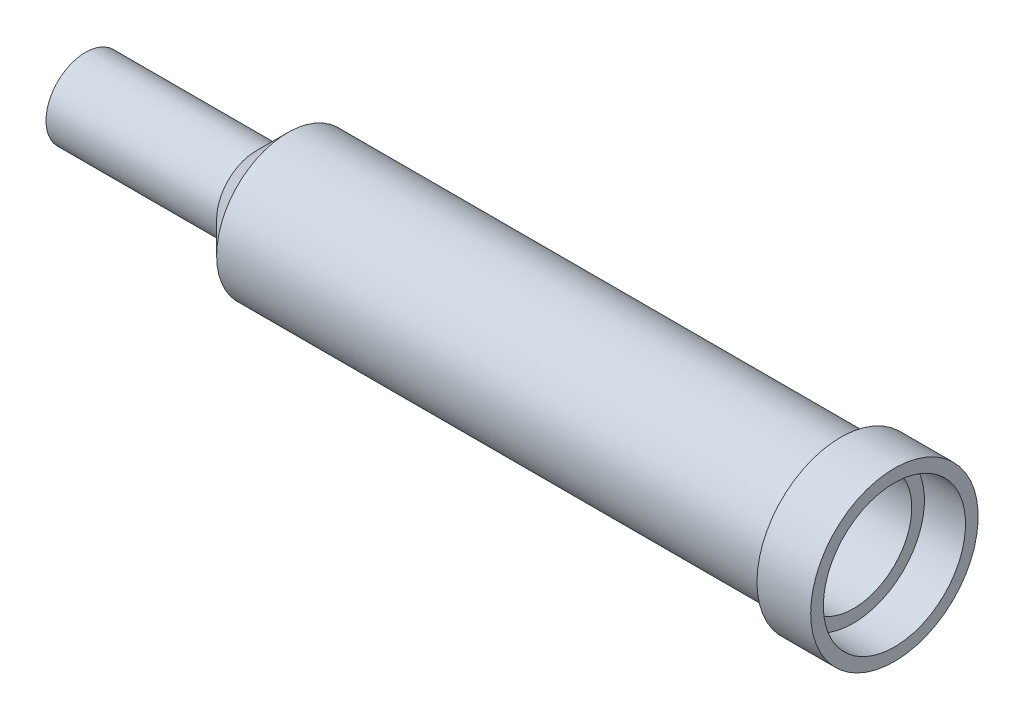
ISO-10303-21;
HEADER;
FILE_DESCRIPTION(('STEP AP214'),'2;1');
FILE_NAME('part.step','',(''),(''),'','','');
FILE_SCHEMA(('AUTOMOTIVE_DESIGN { 1 0 10303 214 1 1 1 1 }'));
ENDSEC;
DATA;
#1=APPLICATION_CONTEXT('core data for automotive mechanical design processes');
#2=APPLICATION_PROTOCOL_DEFINITION('international standard','automotive_design',2000,#1);
#3=PRODUCT_CONTEXT('',#1,'mechanical');
#4=PRODUCT('Part','Part','',(#3));
#5=PRODUCT_RELATED_PRODUCT_CATEGORY('part','',(#4));
#6=PRODUCT_DEFINITION_FORMATION('','',#4);
#7=PRODUCT_DEFINITION_CONTEXT('part definition',#1,'design');
#8=PRODUCT_DEFINITION('design','',#6,#7);
#9=PRODUCT_DEFINITION_SHAPE('','',#8);
#10=(LENGTH_UNIT() NAMED_UNIT(*) SI_UNIT(.MILLI.,.METRE.));
#11=(NAMED_UNIT(*) PLANE_ANGLE_UNIT() SI_UNIT($,.RADIAN.));
#12=(NAMED_UNIT(*) SI_UNIT($,.STERADIAN.) SOLID_ANGLE_UNIT());
#13=UNCERTAINTY_MEASURE_WITH_UNIT(LENGTH_MEASURE(1.E-05),#10,'distance_accuracy_value','');
#14=(GEOMETRIC_REPRESENTATION_CONTEXT(3) GLOBAL_UNCERTAINTY_ASSIGNED_CONTEXT((#13)) GLOBAL_UNIT_ASSIGNED_CONTEXT((#10,
#11,#12)) REPRESENTATION_CONTEXT('',''));
#15=CARTESIAN_POINT('',(0.,0.,0.));
#16=DIRECTION('',(0.,0.,1.));
#17=DIRECTION('',(1.,0.,0.));
#18=AXIS2_PLACEMENT_3D('',#15,#16,#17);
#19=CARTESIAN_POINT('',(-25.6,0.,-1.25));
#20=DIRECTION('',(1.,0.,0.));
#21=DIRECTION('',(0.,0.,-1.));
#22=AXIS2_PLACEMENT_3D('',#19,#20,#21);
#23=PLANE('',#22);
#24=CARTESIAN_POINT('',(-25.6,0.,0.));
#25=DIRECTION('',(-1.,0.,0.));
#26=DIRECTION('',(0.,0.,1.));
#27=AXIS2_PLACEMENT_3D('',#24,#25,#26);
#28=CIRCLE('',#27,0.85);
#29=CARTESIAN_POINT('',(-25.6,0.,0.85));
#30=VERTEX_POINT('',#29);
#31=EDGE_CURVE('E10',#30,#30,#28,.T.);
#32=ORIENTED_EDGE('',*,*,#31,.F.);
#33=EDGE_LOOP('',(#32));
#34=FACE_BOUND('',#33,.T.);
#35=CARTESIAN_POINT('',(-25.6,0.,0.));
#36=DIRECTION('',(-1.,0.,0.));
#37=DIRECTION('',(0.,0.,1.));
#38=AXIS2_PLACEMENT_3D('',#35,#36,#37);
#39=CIRCLE('',#38,1.25);
#40=CARTESIAN_POINT('',(-25.6,0.,1.25));
#41=VERTEX_POINT('',#40);
#42=EDGE_CURVE('E71',#41,#41,#39,.T.);
#43=ORIENTED_EDGE('',*,*,#42,.T.);
#44=EDGE_LOOP('',(#43));
#45=FACE_BOUND('',#44,.T.);
#46=ADVANCED_FACE('F31',(#34,#45),#23,.F.);
#47=CARTESIAN_POINT('',(-52.1170922972491,0.,0.));
#48=DIRECTION('',(-1.,0.,0.));
#49=DIRECTION('',(0.,0.,1.));
#50=AXIS2_PLACEMENT_3D('',#47,#48,#49);
#51=CYLINDRICAL_SURFACE('',#50,0.85);
#52=CARTESIAN_POINT('',(-20.0343145750508,0.,0.));
#53=DIRECTION('',(-1.,0.,0.));
#54=DIRECTION('',(0.,0.,1.));
#55=AXIS2_PLACEMENT_3D('',#52,#53,#54);
#56=CIRCLE('',#55,0.85);
#57=CARTESIAN_POINT('',(-20.0343145750508,0.,0.85));
#58=VERTEX_POINT('',#57);
#59=EDGE_CURVE('E37',#58,#58,#56,.T.);
#60=ORIENTED_EDGE('',*,*,#59,.F.);
#61=EDGE_LOOP('',(#60));
#62=FACE_BOUND('',#61,.T.);
#63=ORIENTED_EDGE('',*,*,#31,.T.);
#64=EDGE_LOOP('',(#63));
#65=FACE_BOUND('',#64,.T.);
#66=ADVANCED_FACE('F132',(#62,#65),#51,.F.);
#67=CARTESIAN_POINT('',(-20.0343145750508,0.,0.));
#68=DIRECTION('',(1.,0.,0.));
#69=DIRECTION('',(0.,0.,-1.));
#70=AXIS2_PLACEMENT_3D('',#67,#68,#69);
#71=CONICAL_SURFACE('',#70,0.85,0.785398163397451);
#72=CARTESIAN_POINT('',(-19.0343145750508,0.,0.));
#73=DIRECTION('',(-1.,0.,0.));
#74=DIRECTION('',(0.,0.,1.));
#75=AXIS2_PLACEMENT_3D('',#72,#73,#74);
#76=CIRCLE('',#75,1.85);
#77=CARTESIAN_POINT('',(-19.0343145750508,0.,1.85));
#78=VERTEX_POINT('',#77);
#79=EDGE_CURVE('E41',#78,#78,#76,.T.);
#80=ORIENTED_EDGE('',*,*,#79,.F.);
#81=EDGE_LOOP('',(#80));
#82=FACE_BOUND('',#81,.T.);
#83=ORIENTED_EDGE('',*,*,#59,.T.);
#84=EDGE_LOOP('',(#83));
#85=FACE_BOUND('',#84,.T.);
#86=ADVANCED_FACE('F127',(#82,#85),#71,.F.);
#87=CARTESIAN_POINT('',(-52.1170922972491,0.,0.));
#88=DIRECTION('',(-1.,0.,0.));
#89=DIRECTION('',(0.,0.,1.));
#90=AXIS2_PLACEMENT_3D('',#87,#88,#89);
#91=CYLINDRICAL_SURFACE('',#90,1.85);
#92=CARTESIAN_POINT('',(-1.3,0.,0.));
#93=DIRECTION('',(-1.,0.,0.));
#94=DIRECTION('',(0.,0.,1.));
#95=AXIS2_PLACEMENT_3D('',#92,#93,#94);
#96=CIRCLE('',#95,1.85);
#97=CARTESIAN_POINT('',(-1.3,0.,1.85));
#98=VERTEX_POINT('',#97);
#99=EDGE_CURVE('E45',#98,#98,#96,.T.);
#100=ORIENTED_EDGE('',*,*,#99,.F.);
#101=EDGE_LOOP('',(#100));
#102=FACE_BOUND('',#101,.T.);
#103=ORIENTED_EDGE('',*,*,#79,.T.);
#104=EDGE_LOOP('',(#103));
#105=FACE_BOUND('',#104,.T.);
#106=ADVANCED_FACE('F121',(#102,#105),#91,.F.);
#107=CARTESIAN_POINT('',(-1.3,0.,-1.85));
#108=DIRECTION('',(-1.,0.,0.));
#109=DIRECTION('',(0.,0.,1.));
#110=AXIS2_PLACEMENT_3D('',#107,#108,#109);
#111=PLANE('',#110);
#112=CARTESIAN_POINT('',(-1.3,0.,0.));
#113=DIRECTION('',(-1.,0.,0.));
#114=DIRECTION('',(0.,0.,1.));
#115=AXIS2_PLACEMENT_3D('',#112,#113,#114);
#116=CIRCLE('',#115,2.25);
#117=CARTESIAN_POINT('',(-1.3,0.,2.25));
#118=VERTEX_POINT('',#117);
#119=EDGE_CURVE('E50',#118,#118,#116,.T.);
#120=ORIENTED_EDGE('',*,*,#119,.F.);
#121=EDGE_LOOP('',(#120));
#122=FACE_BOUND('',#121,.T.);
#123=ORIENTED_EDGE('',*,*,#99,.T.);
#124=EDGE_LOOP('',(#123));
#125=FACE_BOUND('',#124,.T.);
#126=ADVANCED_FACE('F115',(#122,#125),#111,.F.);
#127=CARTESIAN_POINT('',(-52.1170922972491,0.,0.));
#128=DIRECTION('',(-1.,0.,0.));
#129=DIRECTION('',(0.,0.,1.));
#130=AXIS2_PLACEMENT_3D('',#127,#128,#129);
#131=CYLINDRICAL_SURFACE('',#130,2.25);
#132=CARTESIAN_POINT('',(0.,0.,0.));
#133=DIRECTION('',(-1.,0.,0.));
#134=DIRECTION('',(0.,0.,1.));
#135=AXIS2_PLACEMENT_3D('',#132,#133,#134);
#136=CIRCLE('',#135,2.25);
#137=CARTESIAN_POINT('',(0.,0.,2.25));
#138=VERTEX_POINT('',#137);
#139=EDGE_CURVE('E53',#138,#138,#136,.T.);
#140=ORIENTED_EDGE('',*,*,#139,.F.);
#141=EDGE_LOOP('',(#140));
#142=FACE_BOUND('',#141,.T.);
#143=ORIENTED_EDGE('',*,*,#119,.T.);
#144=EDGE_LOOP('',(#143));
#145=FACE_BOUND('',#144,.T.);
#146=ADVANCED_FACE('F109',(#142,#145),#131,.F.);
#147=CARTESIAN_POINT('',(0.,0.,-2.65));
#148=DIRECTION('',(-1.,0.,0.));
#149=DIRECTION('',(0.,0.,1.));
#150=AXIS2_PLACEMENT_3D('',#147,#148,#149);
#151=PLANE('',#150);
#152=CARTESIAN_POINT('',(0.,0.,0.));
#153=DIRECTION('',(-1.,0.,0.));
#154=DIRECTION('',(0.,0.,1.));
#155=AXIS2_PLACEMENT_3D('',#152,#153,#154);
#156=CIRCLE('',#155,2.65);
#157=CARTESIAN_POINT('',(0.,0.,2.65));
#158=VERTEX_POINT('',#157);
#159=EDGE_CURVE('E56',#158,#158,#156,.T.);
#160=ORIENTED_EDGE('',*,*,#159,.F.);
#161=EDGE_LOOP('',(#160));
#162=FACE_BOUND('',#161,.T.);
#163=ORIENTED_EDGE('',*,*,#139,.T.);
#164=EDGE_LOOP('',(#163));
#165=FACE_BOUND('',#164,.T.);
#166=ADVANCED_FACE('F103',(#162,#165),#151,.F.);
#167=CARTESIAN_POINT('',(-52.1170922972491,0.,0.));
#168=DIRECTION('',(-1.,0.,0.));
#169=DIRECTION('',(0.,0.,1.));
#170=AXIS2_PLACEMENT_3D('',#167,#168,#169);
#171=CYLINDRICAL_SURFACE('',#170,2.65);
#172=CARTESIAN_POINT('',(-1.7,0.,0.));
#173=DIRECTION('',(-1.,0.,0.));
#174=DIRECTION('',(0.,0.,1.));
#175=AXIS2_PLACEMENT_3D('',#172,#173,#174);
#176=CIRCLE('',#175,2.65);
#177=CARTESIAN_POINT('',(-1.7,0.,2.65));
#178=VERTEX_POINT('',#177);
#179=EDGE_CURVE('E59',#178,#178,#176,.T.);
#180=ORIENTED_EDGE('',*,*,#179,.F.);
#181=EDGE_LOOP('',(#180));
#182=FACE_BOUND('',#181,.T.);
#183=ORIENTED_EDGE('',*,*,#159,.T.);
#184=EDGE_LOOP('',(#183));
#185=FACE_BOUND('',#184,.T.);
#186=ADVANCED_FACE('F97',(#182,#185),#171,.T.);
#187=CARTESIAN_POINT('',(-1.7,0.,-2.25));
#188=DIRECTION('',(1.,0.,0.));
#189=DIRECTION('',(0.,0.,-1.));
#190=AXIS2_PLACEMENT_3D('',#187,#188,#189);
#191=PLANE('',#190);
#192=CARTESIAN_POINT('',(-1.7,0.,0.));
#193=DIRECTION('',(-1.,0.,0.));
#194=DIRECTION('',(0.,0.,1.));
#195=AXIS2_PLACEMENT_3D('',#192,#193,#194);
#196=CIRCLE('',#195,2.25);
#197=CARTESIAN_POINT('',(-1.7,0.,2.25));
#198=VERTEX_POINT('',#197);
#199=EDGE_CURVE('E62',#198,#198,#196,.T.);
#200=ORIENTED_EDGE('',*,*,#199,.F.);
#201=EDGE_LOOP('',(#200));
#202=FACE_BOUND('',#201,.T.);
#203=ORIENTED_EDGE('',*,*,#179,.T.);
#204=EDGE_LOOP('',(#203));
#205=FACE_BOUND('',#204,.T.);
#206=ADVANCED_FACE('F91',(#202,#205),#191,.F.);
#207=CARTESIAN_POINT('',(-52.1170922972491,0.,0.));
#208=DIRECTION('',(-1.,0.,0.));
#209=DIRECTION('',(0.,0.,1.));
#210=AXIS2_PLACEMENT_3D('',#207,#208,#209);
#211=CYLINDRICAL_SURFACE('',#210,2.25);
#212=CARTESIAN_POINT('',(-19.2,0.,0.));
#213=DIRECTION('',(-1.,0.,0.));
#214=DIRECTION('',(0.,0.,1.));
#215=AXIS2_PLACEMENT_3D('',#212,#213,#214);
#216=CIRCLE('',#215,2.25);
#217=CARTESIAN_POINT('',(-19.2,0.,2.25));
#218=VERTEX_POINT('',#217);
#219=EDGE_CURVE('E65',#218,#218,#216,.T.);
#220=ORIENTED_EDGE('',*,*,#219,.F.);
#221=EDGE_LOOP('',(#220));
#222=FACE_BOUND('',#221,.T.);
#223=ORIENTED_EDGE('',*,*,#199,.T.);
#224=EDGE_LOOP('',(#223));
#225=FACE_BOUND('',#224,.T.);
#226=ADVANCED_FACE('F85',(#222,#225),#211,.T.);
#227=CARTESIAN_POINT('',(-19.2,0.,0.));
#228=DIRECTION('',(1.,0.,0.));
#229=DIRECTION('',(0.,0.,-1.));
#230=AXIS2_PLACEMENT_3D('',#227,#228,#229);
#231=CONICAL_SURFACE('',#230,2.25,0.785398163397451);
#232=CARTESIAN_POINT('',(-20.2,0.,0.));
#233=DIRECTION('',(-1.,0.,0.));
#234=DIRECTION('',(0.,0.,1.));
#235=AXIS2_PLACEMENT_3D('',#232,#233,#234);
#236=CIRCLE('',#235,1.25);
#237=CARTESIAN_POINT('',(-20.2,0.,1.25));
#238=VERTEX_POINT('',#237);
#239=EDGE_CURVE('E68',#238,#238,#236,.T.);
#240=ORIENTED_EDGE('',*,*,#239,.F.);
#241=EDGE_LOOP('',(#240));
#242=FACE_BOUND('',#241,.T.);
#243=ORIENTED_EDGE('',*,*,#219,.T.);
#244=EDGE_LOOP('',(#243));
#245=FACE_BOUND('',#244,.T.);
#246=ADVANCED_FACE('F79',(#242,#245),#231,.T.);
#247=CARTESIAN_POINT('',(-52.1170922972491,0.,0.));
#248=DIRECTION('',(-1.,0.,0.));
#249=DIRECTION('',(0.,0.,1.));
#250=AXIS2_PLACEMENT_3D('',#247,#248,#249);
#251=CYLINDRICAL_SURFACE('',#250,1.25);
#252=ORIENTED_EDGE('',*,*,#42,.F.);
#253=EDGE_LOOP('',(#252));
#254=FACE_BOUND('',#253,.T.);
#255=ORIENTED_EDGE('',*,*,#239,.T.);
#256=EDGE_LOOP('',(#255));
#257=FACE_BOUND('',#256,.T.);
#258=ADVANCED_FACE('F76',(#254,#257),#251,.T.);
#259=CLOSED_SHELL('',(#46,#66,#86,#106,#126,#146,#166,#186,#206,#226,#246,#258));
#260=MANIFOLD_SOLID_BREP('B2',#259);
#261=ADVANCED_BREP_SHAPE_REPRESENTATION('',(#18,#260),#14);
#262=SHAPE_DEFINITION_REPRESENTATION(#9,#261);
ENDSEC;
END-ISO-10303-21;
